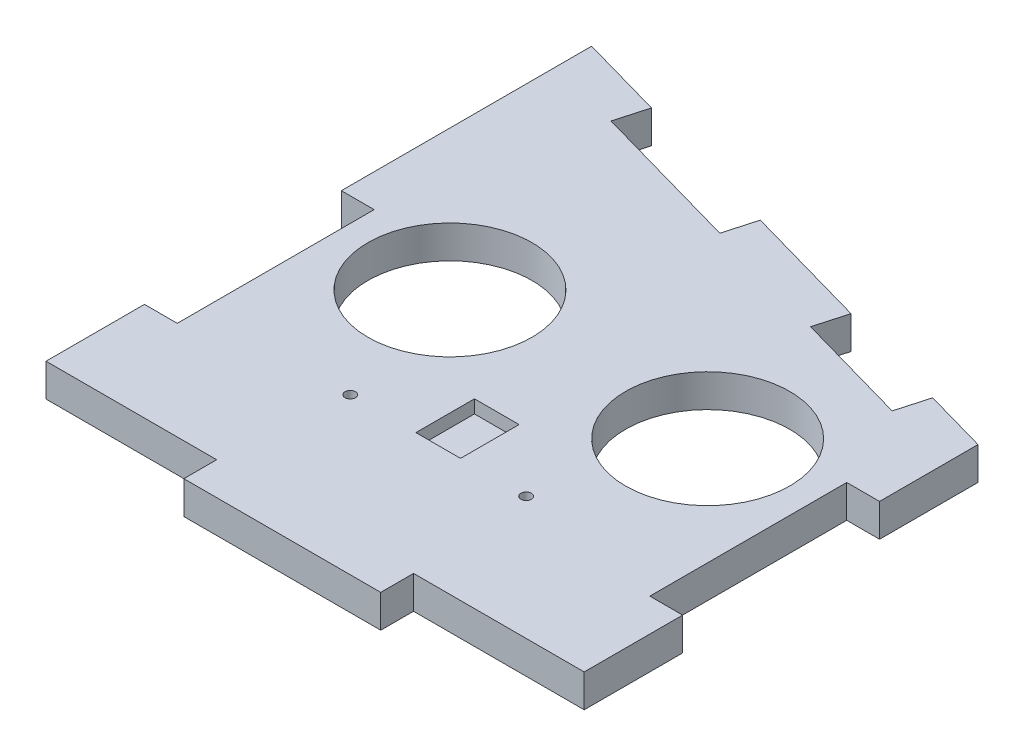
ISO-10303-21;
HEADER;
FILE_DESCRIPTION(('STEP AP214'),'2;1');
FILE_NAME('part.step','',(''),(''),'','','');
FILE_SCHEMA(('AUTOMOTIVE_DESIGN { 1 0 10303 214 1 1 1 1 }'));
ENDSEC;
DATA;
#1=APPLICATION_CONTEXT('core data for automotive mechanical design processes');
#2=APPLICATION_PROTOCOL_DEFINITION('international standard','automotive_design',2000,#1);
#3=PRODUCT_CONTEXT('',#1,'mechanical');
#4=PRODUCT('Part','Part','',(#3));
#5=PRODUCT_RELATED_PRODUCT_CATEGORY('part','',(#4));
#6=PRODUCT_DEFINITION_FORMATION('','',#4);
#7=PRODUCT_DEFINITION_CONTEXT('part definition',#1,'design');
#8=PRODUCT_DEFINITION('design','',#6,#7);
#9=PRODUCT_DEFINITION_SHAPE('','',#8);
#10=(LENGTH_UNIT() NAMED_UNIT(*) SI_UNIT(.MILLI.,.METRE.));
#11=(NAMED_UNIT(*) PLANE_ANGLE_UNIT() SI_UNIT($,.RADIAN.));
#12=(NAMED_UNIT(*) SI_UNIT($,.STERADIAN.) SOLID_ANGLE_UNIT());
#13=UNCERTAINTY_MEASURE_WITH_UNIT(LENGTH_MEASURE(1.E-05),#10,'distance_accuracy_value','');
#14=(GEOMETRIC_REPRESENTATION_CONTEXT(3) GLOBAL_UNCERTAINTY_ASSIGNED_CONTEXT((#13)) GLOBAL_UNIT_ASSIGNED_CONTEXT((#10,
#11,#12)) REPRESENTATION_CONTEXT('',''));
#15=CARTESIAN_POINT('',(0.,0.,0.));
#16=DIRECTION('',(0.,0.,1.));
#17=DIRECTION('',(1.,0.,0.));
#18=AXIS2_PLACEMENT_3D('',#15,#16,#17);
#19=CARTESIAN_POINT('',(0.,3.175,0.));
#20=DIRECTION('',(0.,1.,0.));
#21=DIRECTION('',(0.,0.,1.));
#22=AXIS2_PLACEMENT_3D('',#19,#20,#21);
#23=PLANE('',#22);
#24=CARTESIAN_POINT('',(34.544,3.175,-11.9107261914071));
#25=DIRECTION('',(0.,1.,0.));
#26=DIRECTION('',(0.,0.,1.));
#27=AXIS2_PLACEMENT_3D('',#24,#25,#26);
#28=CIRCLE('',#27,0.508000000000002);
#29=CARTESIAN_POINT('',(34.544,3.175,-11.4027261914071));
#30=VERTEX_POINT('',#29);
#31=EDGE_CURVE('E468',#30,#30,#28,.T.);
#32=ORIENTED_EDGE('',*,*,#31,.F.);
#33=EDGE_LOOP('',(#32));
#34=FACE_BOUND('',#33,.T.);
#35=CARTESIAN_POINT('',(17.526,3.175,-11.9107261914071));
#36=DIRECTION('',(0.,1.,0.));
#37=DIRECTION('',(0.,0.,1.));
#38=AXIS2_PLACEMENT_3D('',#35,#36,#37);
#39=CIRCLE('',#38,0.508000000000002);
#40=CARTESIAN_POINT('',(17.526,3.175,-11.4027261914071));
#41=VERTEX_POINT('',#40);
#42=EDGE_CURVE('E462',#41,#41,#39,.T.);
#43=ORIENTED_EDGE('',*,*,#42,.F.);
#44=EDGE_LOOP('',(#43));
#45=FACE_BOUND('',#44,.T.);
#46=DIRECTION('',(0.,0.,1.));
#47=VECTOR('',#46,1.);
#48=CARTESIAN_POINT('',(23.876,3.175,-17.5749261914071));
#49=LINE('',#48,#47);
#50=CARTESIAN_POINT('',(23.876,3.175,-17.5749261914071));
#51=VERTEX_POINT('',#50);
#52=CARTESIAN_POINT('',(23.876,3.175,-11.9107261914071));
#53=VERTEX_POINT('',#52);
#54=EDGE_CURVE('E48',#51,#53,#49,.T.);
#55=ORIENTED_EDGE('',*,*,#54,.F.);
#56=DIRECTION('',(-1.,0.,0.));
#57=VECTOR('',#56,1.);
#58=CARTESIAN_POINT('',(23.876,3.175,-17.5749261914071));
#59=LINE('',#58,#57);
#60=CARTESIAN_POINT('',(28.194,3.175,-17.5749261914071));
#61=VERTEX_POINT('',#60);
#62=EDGE_CURVE('E440',#61,#51,#59,.T.);
#63=ORIENTED_EDGE('',*,*,#62,.F.);
#64=DIRECTION('',(0.,0.,-1.));
#65=VECTOR('',#64,1.);
#66=CARTESIAN_POINT('',(28.194,3.175,-17.5749261914071));
#67=LINE('',#66,#65);
#68=CARTESIAN_POINT('',(28.194,3.175,-11.9107261914071));
#69=VERTEX_POINT('',#68);
#70=EDGE_CURVE('E444',#69,#61,#67,.T.);
#71=ORIENTED_EDGE('',*,*,#70,.F.);
#72=DIRECTION('',(1.,0.,0.));
#73=VECTOR('',#72,1.);
#74=CARTESIAN_POINT('',(23.876,3.175,-11.9107261914071));
#75=LINE('',#74,#73);
#76=EDGE_CURVE('E447',#53,#69,#75,.T.);
#77=ORIENTED_EDGE('',*,*,#76,.F.);
#78=EDGE_LOOP('',(#55,#63,#71,#77));
#79=FACE_BOUND('',#78,.T.);
#80=CARTESIAN_POINT('',(13.56995,3.175,-25.5124261914071));
#81=DIRECTION('',(0.,1.,0.));
#82=DIRECTION('',(0.,0.,1.));
#83=AXIS2_PLACEMENT_3D('',#80,#81,#82);
#84=CIRCLE('',#83,7.9375);
#85=CARTESIAN_POINT('',(13.56995,3.175,-17.5749261914071));
#86=VERTEX_POINT('',#85);
#87=EDGE_CURVE('E242',#86,#86,#84,.T.);
#88=ORIENTED_EDGE('',*,*,#87,.F.);
#89=EDGE_LOOP('',(#88));
#90=FACE_BOUND('',#89,.T.);
#91=DIRECTION('',(0.,0.,1.));
#92=VECTOR('',#91,1.);
#93=CARTESIAN_POINT('',(0.,3.175,-9.525));
#94=LINE('',#93,#92);
#95=CARTESIAN_POINT('',(0.,3.175,-9.525));
#96=VERTEX_POINT('',#95);
#97=CARTESIAN_POINT('',(0.,3.175,0.));
#98=VERTEX_POINT('',#97);
#99=EDGE_CURVE('E286',#96,#98,#94,.T.);
#100=ORIENTED_EDGE('',*,*,#99,.T.);
#101=DIRECTION('',(1.,0.,0.));
#102=VECTOR('',#101,1.);
#103=CARTESIAN_POINT('',(0.,3.175,0.));
#104=LINE('',#103,#102);
#105=CARTESIAN_POINT('',(16.51,3.175,0.));
#106=VERTEX_POINT('',#105);
#107=EDGE_CURVE('E146',#98,#106,#104,.T.);
#108=ORIENTED_EDGE('',*,*,#107,.T.);
#109=DIRECTION('',(0.,0.,1.));
#110=VECTOR('',#109,1.);
#111=CARTESIAN_POINT('',(16.51,3.175,0.));
#112=LINE('',#111,#110);
#113=CARTESIAN_POINT('',(16.51,3.175,3.175));
#114=VERTEX_POINT('',#113);
#115=EDGE_CURVE('E349',#106,#114,#112,.T.);
#116=ORIENTED_EDGE('',*,*,#115,.T.);
#117=DIRECTION('',(1.,0.,0.));
#118=VECTOR('',#117,1.);
#119=CARTESIAN_POINT('',(16.51,3.175,3.175));
#120=LINE('',#119,#118);
#121=CARTESIAN_POINT('',(35.56,3.175,3.175));
#122=VERTEX_POINT('',#121);
#123=EDGE_CURVE('E368',#114,#122,#120,.T.);
#124=ORIENTED_EDGE('',*,*,#123,.T.);
#125=DIRECTION('',(0.,0.,-1.));
#126=VECTOR('',#125,1.);
#127=CARTESIAN_POINT('',(35.56,3.175,3.175));
#128=LINE('',#127,#126);
#129=CARTESIAN_POINT('',(35.56,3.175,0.));
#130=VERTEX_POINT('',#129);
#131=EDGE_CURVE('E365',#122,#130,#128,.T.);
#132=ORIENTED_EDGE('',*,*,#131,.T.);
#133=DIRECTION('',(1.,0.,0.));
#134=VECTOR('',#133,1.);
#135=CARTESIAN_POINT('',(35.56,3.175,0.));
#136=LINE('',#135,#134);
#137=CARTESIAN_POINT('',(52.07,3.175,0.));
#138=VERTEX_POINT('',#137);
#139=EDGE_CURVE('E367',#130,#138,#136,.T.);
#140=ORIENTED_EDGE('',*,*,#139,.T.);
#141=DIRECTION('',(0.,0.,-1.));
#142=VECTOR('',#141,1.);
#143=CARTESIAN_POINT('',(52.07,3.175,0.));
#144=LINE('',#143,#142);
#145=CARTESIAN_POINT('',(52.07,3.175,-9.525));
#146=VERTEX_POINT('',#145);
#147=EDGE_CURVE('E370',#138,#146,#144,.T.);
#148=ORIENTED_EDGE('',*,*,#147,.T.);
#149=DIRECTION('',(-1.,0.,0.));
#150=VECTOR('',#149,1.);
#151=CARTESIAN_POINT('',(52.07,3.175,-9.525));
#152=LINE('',#151,#150);
#153=CARTESIAN_POINT('',(48.895,3.175,-9.525));
#154=VERTEX_POINT('',#153);
#155=EDGE_CURVE('E376',#146,#154,#152,.T.);
#156=ORIENTED_EDGE('',*,*,#155,.T.);
#157=DIRECTION('',(0.,0.,-1.));
#158=VECTOR('',#157,1.);
#159=CARTESIAN_POINT('',(48.895,3.175,-9.525));
#160=LINE('',#159,#158);
#161=CARTESIAN_POINT('',(48.895,3.175,-28.575));
#162=VERTEX_POINT('',#161);
#163=EDGE_CURVE('E378',#154,#162,#160,.T.);
#164=ORIENTED_EDGE('',*,*,#163,.T.);
#165=DIRECTION('',(1.,0.,0.));
#166=VECTOR('',#165,1.);
#167=CARTESIAN_POINT('',(48.895,3.175,-28.575));
#168=LINE('',#167,#166);
#169=CARTESIAN_POINT('',(52.07,3.175,-28.575));
#170=VERTEX_POINT('',#169);
#171=EDGE_CURVE('E380',#162,#170,#168,.T.);
#172=ORIENTED_EDGE('',*,*,#171,.T.);
#173=DIRECTION('',(0.,0.,-1.));
#174=VECTOR('',#173,1.);
#175=CARTESIAN_POINT('',(52.07,3.175,-28.575));
#176=LINE('',#175,#174);
#177=CARTESIAN_POINT('',(52.07,3.175,-38.1));
#178=VERTEX_POINT('',#177);
#179=EDGE_CURVE('E382',#170,#178,#176,.T.);
#180=ORIENTED_EDGE('',*,*,#179,.T.);
#181=DIRECTION('',(-0.962441314553991,0.,-0.27148980835307));
#182=VECTOR('',#181,1.);
#183=CARTESIAN_POINT('',(52.07,3.175,-38.1));
#184=LINE('',#183,#182);
#185=CARTESIAN_POINT('',(45.9584976525822,3.175,-39.823960283042));
#186=VERTEX_POINT('',#185);
#187=EDGE_CURVE('E384',#178,#186,#184,.T.);
#188=ORIENTED_EDGE('',*,*,#187,.T.);
#189=DIRECTION('',(-0.27148980835307,0.,0.962441314553991));
#190=VECTOR('',#189,1.);
#191=CARTESIAN_POINT('',(45.9584976525822,3.175,-39.823960283042));
#192=LINE('',#191,#190);
#193=CARTESIAN_POINT('',(45.0965175110611,3.175,-36.768209109333));
#194=VERTEX_POINT('',#193);
#195=EDGE_CURVE('E386',#186,#194,#192,.T.);
#196=ORIENTED_EDGE('',*,*,#195,.T.);
#197=DIRECTION('',(-0.962441314553991,0.,-0.271489808353068));
#198=VECTOR('',#197,1.);
#199=CARTESIAN_POINT('',(45.0965175110611,3.175,-36.768209109333));
#200=LINE('',#199,#198);
#201=CARTESIAN_POINT('',(34.095813285709,3.175,-39.8713376188086));
#202=VERTEX_POINT('',#201);
#203=EDGE_CURVE('E388',#194,#202,#200,.T.);
#204=ORIENTED_EDGE('',*,*,#203,.T.);
#205=DIRECTION('',(0.27148980835307,0.,-0.96244131455399));
#206=VECTOR('',#205,1.);
#207=CARTESIAN_POINT('',(34.095813285709,3.175,-39.8713376188086));
#208=LINE('',#207,#206);
#209=CARTESIAN_POINT('',(34.9577934272301,3.175,-42.9270887925176));
#210=VERTEX_POINT('',#209);
#211=EDGE_CURVE('E390',#202,#210,#208,.T.);
#212=ORIENTED_EDGE('',*,*,#211,.T.);
#213=DIRECTION('',(-0.962441314553991,0.,-0.27148980835307));
#214=VECTOR('',#213,1.);
#215=CARTESIAN_POINT('',(34.9577934272301,3.175,-42.9270887925176));
#216=LINE('',#215,#214);
#217=CARTESIAN_POINT('',(22.7347887323944,3.175,-46.3750093586016));
#218=VERTEX_POINT('',#217);
#219=EDGE_CURVE('E392',#210,#218,#216,.T.);
#220=ORIENTED_EDGE('',*,*,#219,.T.);
#221=DIRECTION('',(-0.271489808353069,0.,0.962441314553991));
#222=VECTOR('',#221,1.);
#223=CARTESIAN_POINT('',(22.7347887323944,3.175,-46.3750093586016));
#224=LINE('',#223,#222);
#225=CARTESIAN_POINT('',(21.8728085908734,3.175,-43.3192581848926));
#226=VERTEX_POINT('',#225);
#227=EDGE_CURVE('E394',#218,#226,#224,.T.);
#228=ORIENTED_EDGE('',*,*,#227,.T.);
#229=DIRECTION('',(-0.96244131455399,0.,-0.27148980835307));
#230=VECTOR('',#229,1.);
#231=CARTESIAN_POINT('',(21.8728085908734,3.175,-43.3192581848926));
#232=LINE('',#231,#230);
#233=CARTESIAN_POINT('',(7.20520295707054,3.175,-47.4567628641934));
#234=VERTEX_POINT('',#233);
#235=EDGE_CURVE('E396',#226,#234,#232,.T.);
#236=ORIENTED_EDGE('',*,*,#235,.T.);
#237=DIRECTION('',(0.27148980835307,0.,-0.962441314553991));
#238=VECTOR('',#237,1.);
#239=CARTESIAN_POINT('',(7.20520295707054,3.175,-47.4567628641934));
#240=LINE('',#239,#238);
#241=CARTESIAN_POINT('',(8.06718309859155,3.175,-50.5125140379023));
#242=VERTEX_POINT('',#241);
#243=EDGE_CURVE('E398',#234,#242,#240,.T.);
#244=ORIENTED_EDGE('',*,*,#243,.T.);
#245=DIRECTION('',(-0.962441314553991,0.,-0.27148980835307));
#246=VECTOR('',#245,1.);
#247=CARTESIAN_POINT('',(8.06718309859155,3.175,-50.5125140379023));
#248=LINE('',#247,#246);
#249=CARTESIAN_POINT('',(0.,3.175,-52.7881416115178));
#250=VERTEX_POINT('',#249);
#251=EDGE_CURVE('E400',#242,#250,#248,.T.);
#252=ORIENTED_EDGE('',*,*,#251,.T.);
#253=DIRECTION('',(0.,0.,1.));
#254=VECTOR('',#253,1.);
#255=CARTESIAN_POINT('',(0.,3.175,-52.7881416115178));
#256=LINE('',#255,#254);
#257=CARTESIAN_POINT('',(0.,3.175,-28.575));
#258=VERTEX_POINT('',#257);
#259=EDGE_CURVE('E217',#250,#258,#256,.T.);
#260=ORIENTED_EDGE('',*,*,#259,.T.);
#261=DIRECTION('',(1.,0.,0.));
#262=VECTOR('',#261,1.);
#263=CARTESIAN_POINT('',(0.,3.175,-28.575));
#264=LINE('',#263,#262);
#265=CARTESIAN_POINT('',(3.175,3.175,-28.575));
#266=VERTEX_POINT('',#265);
#267=EDGE_CURVE('E210',#258,#266,#264,.T.);
#268=ORIENTED_EDGE('',*,*,#267,.T.);
#269=DIRECTION('',(0.,0.,1.));
#270=VECTOR('',#269,1.);
#271=CARTESIAN_POINT('',(3.175,3.175,-28.575));
#272=LINE('',#271,#270);
#273=CARTESIAN_POINT('',(3.175,3.175,-9.525));
#274=VERTEX_POINT('',#273);
#275=EDGE_CURVE('E214',#266,#274,#272,.T.);
#276=ORIENTED_EDGE('',*,*,#275,.T.);
#277=DIRECTION('',(-1.,0.,0.));
#278=VECTOR('',#277,1.);
#279=CARTESIAN_POINT('',(3.175,3.175,-9.525));
#280=LINE('',#279,#278);
#281=EDGE_CURVE('E57',#274,#96,#280,.T.);
#282=ORIENTED_EDGE('',*,*,#281,.T.);
#283=EDGE_LOOP('',(#100,#108,#116,#124,#132,#140,#148,#156,#164,#172,#180,#188,#196,#204,#212,
#220,#228,#236,#244,#252,#260,#268,#276,#282));
#284=FACE_BOUND('',#283,.T.);
#285=CARTESIAN_POINT('',(38.50005,3.175,-25.5124261914071));
#286=DIRECTION('',(0.,1.,0.));
#287=DIRECTION('',(0.,0.,1.));
#288=AXIS2_PLACEMENT_3D('',#285,#286,#287);
#289=CIRCLE('',#288,7.9375);
#290=CARTESIAN_POINT('',(38.50005,3.175,-17.5749261914071));
#291=VERTEX_POINT('',#290);
#292=EDGE_CURVE('E421',#291,#291,#289,.T.);
#293=ORIENTED_EDGE('',*,*,#292,.F.);
#294=EDGE_LOOP('',(#293));
#295=FACE_BOUND('',#294,.T.);
#296=ADVANCED_FACE('F33',(#34,#45,#79,#90,#284,#295),#23,.T.);
#297=CARTESIAN_POINT('',(0.,0.,0.));
#298=DIRECTION('',(0.,1.,0.));
#299=DIRECTION('',(0.,0.,1.));
#300=AXIS2_PLACEMENT_3D('',#297,#298,#299);
#301=PLANE('',#300);
#302=CARTESIAN_POINT('',(34.544,0.,-11.9107261914071));
#303=DIRECTION('',(0.,1.,0.));
#304=DIRECTION('',(0.,0.,1.));
#305=AXIS2_PLACEMENT_3D('',#302,#303,#304);
#306=CIRCLE('',#305,0.508000000000002);
#307=CARTESIAN_POINT('',(34.544,0.,-11.4027261914071));
#308=VERTEX_POINT('',#307);
#309=EDGE_CURVE('E465',#308,#308,#306,.T.);
#310=ORIENTED_EDGE('',*,*,#309,.T.);
#311=EDGE_LOOP('',(#310));
#312=FACE_BOUND('',#311,.T.);
#313=CARTESIAN_POINT('',(17.526,0.,-11.9107261914071));
#314=DIRECTION('',(0.,1.,0.));
#315=DIRECTION('',(0.,0.,1.));
#316=AXIS2_PLACEMENT_3D('',#313,#314,#315);
#317=CIRCLE('',#316,0.508000000000002);
#318=CARTESIAN_POINT('',(17.526,0.,-11.4027261914071));
#319=VERTEX_POINT('',#318);
#320=EDGE_CURVE('E451',#319,#319,#317,.T.);
#321=ORIENTED_EDGE('',*,*,#320,.T.);
#322=EDGE_LOOP('',(#321));
#323=FACE_BOUND('',#322,.T.);
#324=DIRECTION('',(0.,0.,1.));
#325=VECTOR('',#324,1.);
#326=CARTESIAN_POINT('',(0.,0.,-9.525));
#327=LINE('',#326,#325);
#328=CARTESIAN_POINT('',(0.,0.,-9.525));
#329=VERTEX_POINT('',#328);
#330=CARTESIAN_POINT('',(0.,0.,0.));
#331=VERTEX_POINT('',#330);
#332=EDGE_CURVE('E238',#329,#331,#327,.T.);
#333=ORIENTED_EDGE('',*,*,#332,.F.);
#334=DIRECTION('',(-1.,0.,0.));
#335=VECTOR('',#334,1.);
#336=CARTESIAN_POINT('',(3.175,0.,-9.525));
#337=LINE('',#336,#335);
#338=CARTESIAN_POINT('',(3.175,0.,-9.525));
#339=VERTEX_POINT('',#338);
#340=EDGE_CURVE('E138',#339,#329,#337,.T.);
#341=ORIENTED_EDGE('',*,*,#340,.F.);
#342=DIRECTION('',(0.,0.,1.));
#343=VECTOR('',#342,1.);
#344=CARTESIAN_POINT('',(3.175,0.,-28.575));
#345=LINE('',#344,#343);
#346=CARTESIAN_POINT('',(3.175,0.,-28.575));
#347=VERTEX_POINT('',#346);
#348=EDGE_CURVE('E283',#347,#339,#345,.T.);
#349=ORIENTED_EDGE('',*,*,#348,.F.);
#350=DIRECTION('',(1.,0.,0.));
#351=VECTOR('',#350,1.);
#352=CARTESIAN_POINT('',(0.,0.,-28.575));
#353=LINE('',#352,#351);
#354=CARTESIAN_POINT('',(0.,0.,-28.575));
#355=VERTEX_POINT('',#354);
#356=EDGE_CURVE('E226',#355,#347,#353,.T.);
#357=ORIENTED_EDGE('',*,*,#356,.F.);
#358=DIRECTION('',(0.,0.,1.));
#359=VECTOR('',#358,1.);
#360=CARTESIAN_POINT('',(0.,0.,-52.7881416115178));
#361=LINE('',#360,#359);
#362=CARTESIAN_POINT('',(0.,0.,-52.7881416115178));
#363=VERTEX_POINT('',#362);
#364=EDGE_CURVE('E280',#363,#355,#361,.T.);
#365=ORIENTED_EDGE('',*,*,#364,.F.);
#366=DIRECTION('',(-0.962441314553991,0.,-0.27148980835307));
#367=VECTOR('',#366,1.);
#368=CARTESIAN_POINT('',(8.06718309859155,0.,-50.5125140379023));
#369=LINE('',#368,#367);
#370=CARTESIAN_POINT('',(8.06718309859155,0.,-50.5125140379023));
#371=VERTEX_POINT('',#370);
#372=EDGE_CURVE('E278',#371,#363,#369,.T.);
#373=ORIENTED_EDGE('',*,*,#372,.F.);
#374=DIRECTION('',(0.27148980835307,0.,-0.962441314553991));
#375=VECTOR('',#374,1.);
#376=CARTESIAN_POINT('',(7.20520295707054,0.,-47.4567628641934));
#377=LINE('',#376,#375);
#378=CARTESIAN_POINT('',(7.20520295707054,0.,-47.4567628641934));
#379=VERTEX_POINT('',#378);
#380=EDGE_CURVE('E276',#379,#371,#377,.T.);
#381=ORIENTED_EDGE('',*,*,#380,.F.);
#382=DIRECTION('',(-0.96244131455399,0.,-0.27148980835307));
#383=VECTOR('',#382,1.);
#384=CARTESIAN_POINT('',(21.8728085908734,0.,-43.3192581848926));
#385=LINE('',#384,#383);
#386=CARTESIAN_POINT('',(21.8728085908734,0.,-43.3192581848926));
#387=VERTEX_POINT('',#386);
#388=EDGE_CURVE('E274',#387,#379,#385,.T.);
#389=ORIENTED_EDGE('',*,*,#388,.F.);
#390=DIRECTION('',(-0.271489808353069,0.,0.962441314553991));
#391=VECTOR('',#390,1.);
#392=CARTESIAN_POINT('',(22.7347887323944,0.,-46.3750093586016));
#393=LINE('',#392,#391);
#394=CARTESIAN_POINT('',(22.7347887323944,0.,-46.3750093586016));
#395=VERTEX_POINT('',#394);
#396=EDGE_CURVE('E272',#395,#387,#393,.T.);
#397=ORIENTED_EDGE('',*,*,#396,.F.);
#398=DIRECTION('',(-0.962441314553991,0.,-0.27148980835307));
#399=VECTOR('',#398,1.);
#400=CARTESIAN_POINT('',(34.9577934272301,0.,-42.9270887925176));
#401=LINE('',#400,#399);
#402=CARTESIAN_POINT('',(34.9577934272301,0.,-42.9270887925176));
#403=VERTEX_POINT('',#402);
#404=EDGE_CURVE('E270',#403,#395,#401,.T.);
#405=ORIENTED_EDGE('',*,*,#404,.F.);
#406=DIRECTION('',(0.27148980835307,0.,-0.96244131455399));
#407=VECTOR('',#406,1.);
#408=CARTESIAN_POINT('',(34.095813285709,0.,-39.8713376188086));
#409=LINE('',#408,#407);
#410=CARTESIAN_POINT('',(34.095813285709,0.,-39.8713376188086));
#411=VERTEX_POINT('',#410);
#412=EDGE_CURVE('E268',#411,#403,#409,.T.);
#413=ORIENTED_EDGE('',*,*,#412,.F.);
#414=DIRECTION('',(-0.962441314553991,0.,-0.271489808353068));
#415=VECTOR('',#414,1.);
#416=CARTESIAN_POINT('',(45.0965175110611,0.,-36.768209109333));
#417=LINE('',#416,#415);
#418=CARTESIAN_POINT('',(45.0965175110611,0.,-36.768209109333));
#419=VERTEX_POINT('',#418);
#420=EDGE_CURVE('E266',#419,#411,#417,.T.);
#421=ORIENTED_EDGE('',*,*,#420,.F.);
#422=DIRECTION('',(-0.27148980835307,0.,0.962441314553991));
#423=VECTOR('',#422,1.);
#424=CARTESIAN_POINT('',(45.9584976525822,0.,-39.823960283042));
#425=LINE('',#424,#423);
#426=CARTESIAN_POINT('',(45.9584976525822,0.,-39.823960283042));
#427=VERTEX_POINT('',#426);
#428=EDGE_CURVE('E264',#427,#419,#425,.T.);
#429=ORIENTED_EDGE('',*,*,#428,.F.);
#430=DIRECTION('',(-0.962441314553991,0.,-0.27148980835307));
#431=VECTOR('',#430,1.);
#432=CARTESIAN_POINT('',(52.07,0.,-38.1));
#433=LINE('',#432,#431);
#434=CARTESIAN_POINT('',(52.07,0.,-38.1));
#435=VERTEX_POINT('',#434);
#436=EDGE_CURVE('E262',#435,#427,#433,.T.);
#437=ORIENTED_EDGE('',*,*,#436,.F.);
#438=DIRECTION('',(0.,0.,-1.));
#439=VECTOR('',#438,1.);
#440=CARTESIAN_POINT('',(52.07,0.,-28.575));
#441=LINE('',#440,#439);
#442=CARTESIAN_POINT('',(52.07,0.,-28.575));
#443=VERTEX_POINT('',#442);
#444=EDGE_CURVE('E260',#443,#435,#441,.T.);
#445=ORIENTED_EDGE('',*,*,#444,.F.);
#446=DIRECTION('',(1.,0.,0.));
#447=VECTOR('',#446,1.);
#448=CARTESIAN_POINT('',(48.895,0.,-28.575));
#449=LINE('',#448,#447);
#450=CARTESIAN_POINT('',(48.895,0.,-28.575));
#451=VERTEX_POINT('',#450);
#452=EDGE_CURVE('E258',#451,#443,#449,.T.);
#453=ORIENTED_EDGE('',*,*,#452,.F.);
#454=DIRECTION('',(0.,0.,-1.));
#455=VECTOR('',#454,1.);
#456=CARTESIAN_POINT('',(48.895,0.,-9.525));
#457=LINE('',#456,#455);
#458=CARTESIAN_POINT('',(48.895,0.,-9.525));
#459=VERTEX_POINT('',#458);
#460=EDGE_CURVE('E256',#459,#451,#457,.T.);
#461=ORIENTED_EDGE('',*,*,#460,.F.);
#462=DIRECTION('',(-1.,0.,0.));
#463=VECTOR('',#462,1.);
#464=CARTESIAN_POINT('',(52.07,0.,-9.525));
#465=LINE('',#464,#463);
#466=CARTESIAN_POINT('',(52.07,0.,-9.525));
#467=VERTEX_POINT('',#466);
#468=EDGE_CURVE('E254',#467,#459,#465,.T.);
#469=ORIENTED_EDGE('',*,*,#468,.F.);
#470=DIRECTION('',(0.,0.,-1.));
#471=VECTOR('',#470,1.);
#472=CARTESIAN_POINT('',(52.07,0.,0.));
#473=LINE('',#472,#471);
#474=CARTESIAN_POINT('',(52.07,0.,0.));
#475=VERTEX_POINT('',#474);
#476=EDGE_CURVE('E252',#475,#467,#473,.T.);
#477=ORIENTED_EDGE('',*,*,#476,.F.);
#478=DIRECTION('',(1.,0.,0.));
#479=VECTOR('',#478,1.);
#480=CARTESIAN_POINT('',(35.56,0.,0.));
#481=LINE('',#480,#479);
#482=CARTESIAN_POINT('',(35.56,0.,0.));
#483=VERTEX_POINT('',#482);
#484=EDGE_CURVE('E250',#483,#475,#481,.T.);
#485=ORIENTED_EDGE('',*,*,#484,.F.);
#486=DIRECTION('',(0.,0.,-1.));
#487=VECTOR('',#486,1.);
#488=CARTESIAN_POINT('',(35.56,0.,3.175));
#489=LINE('',#488,#487);
#490=CARTESIAN_POINT('',(35.56,0.,3.175));
#491=VERTEX_POINT('',#490);
#492=EDGE_CURVE('E248',#491,#483,#489,.T.);
#493=ORIENTED_EDGE('',*,*,#492,.F.);
#494=DIRECTION('',(1.,0.,0.));
#495=VECTOR('',#494,1.);
#496=CARTESIAN_POINT('',(16.51,0.,3.175));
#497=LINE('',#496,#495);
#498=CARTESIAN_POINT('',(16.51,0.,3.175));
#499=VERTEX_POINT('',#498);
#500=EDGE_CURVE('E246',#499,#491,#497,.T.);
#501=ORIENTED_EDGE('',*,*,#500,.F.);
#502=DIRECTION('',(0.,0.,1.));
#503=VECTOR('',#502,1.);
#504=CARTESIAN_POINT('',(16.51,0.,0.));
#505=LINE('',#504,#503);
#506=CARTESIAN_POINT('',(16.51,0.,0.));
#507=VERTEX_POINT('',#506);
#508=EDGE_CURVE('E244',#507,#499,#505,.T.);
#509=ORIENTED_EDGE('',*,*,#508,.F.);
#510=DIRECTION('',(1.,0.,0.));
#511=VECTOR('',#510,1.);
#512=CARTESIAN_POINT('',(0.,0.,0.));
#513=LINE('',#512,#511);
#514=EDGE_CURVE('E241',#331,#507,#513,.T.);
#515=ORIENTED_EDGE('',*,*,#514,.F.);
#516=EDGE_LOOP('',(#333,#341,#349,#357,#365,#373,#381,#389,#397,#405,#413,#421,#429,#437,#445,
#453,#461,#469,#477,#485,#493,#501,#509,#515));
#517=FACE_BOUND('',#516,.T.);
#518=CARTESIAN_POINT('',(13.56995,0.,-25.5124261914071));
#519=DIRECTION('',(0.,1.,0.));
#520=DIRECTION('',(0.,0.,1.));
#521=AXIS2_PLACEMENT_3D('',#518,#519,#520);
#522=CIRCLE('',#521,7.9375);
#523=CARTESIAN_POINT('',(13.56995,0.,-17.5749261914071));
#524=VERTEX_POINT('',#523);
#525=EDGE_CURVE('E418',#524,#524,#522,.T.);
#526=ORIENTED_EDGE('',*,*,#525,.T.);
#527=EDGE_LOOP('',(#526));
#528=FACE_BOUND('',#527,.T.);
#529=CARTESIAN_POINT('',(38.50005,0.,-25.5124261914071));
#530=DIRECTION('',(0.,1.,0.));
#531=DIRECTION('',(0.,0.,1.));
#532=AXIS2_PLACEMENT_3D('',#529,#530,#531);
#533=CIRCLE('',#532,7.9375);
#534=CARTESIAN_POINT('',(38.50005,0.,-17.5749261914071));
#535=VERTEX_POINT('',#534);
#536=EDGE_CURVE('E424',#535,#535,#533,.T.);
#537=ORIENTED_EDGE('',*,*,#536,.T.);
#538=EDGE_LOOP('',(#537));
#539=FACE_BOUND('',#538,.T.);
#540=ADVANCED_FACE('F353',(#312,#323,#517,#528,#539),#301,.F.);
#541=CARTESIAN_POINT('',(0.,3.175,-9.525));
#542=DIRECTION('',(1.,0.,0.));
#543=DIRECTION('',(0.,0.,-1.));
#544=AXIS2_PLACEMENT_3D('',#541,#542,#543);
#545=PLANE('',#544);
#546=ORIENTED_EDGE('',*,*,#332,.T.);
#547=DIRECTION('',(0.,-1.,0.));
#548=VECTOR('',#547,1.);
#549=CARTESIAN_POINT('',(0.,3.175,0.));
#550=LINE('',#549,#548);
#551=EDGE_CURVE('E11',#98,#331,#550,.T.);
#552=ORIENTED_EDGE('',*,*,#551,.F.);
#553=ORIENTED_EDGE('',*,*,#99,.F.);
#554=DIRECTION('',(0.,-1.,0.));
#555=VECTOR('',#554,1.);
#556=CARTESIAN_POINT('',(0.,3.175,-9.525));
#557=LINE('',#556,#555);
#558=EDGE_CURVE('E234',#96,#329,#557,.T.);
#559=ORIENTED_EDGE('',*,*,#558,.T.);
#560=EDGE_LOOP('',(#546,#552,#553,#559));
#561=FACE_BOUND('',#560,.T.);
#562=ADVANCED_FACE('F35',(#561),#545,.F.);
#563=CARTESIAN_POINT('',(0.,3.175,0.));
#564=DIRECTION('',(0.,0.,-1.));
#565=DIRECTION('',(-1.,0.,0.));
#566=AXIS2_PLACEMENT_3D('',#563,#564,#565);
#567=PLANE('',#566);
#568=ORIENTED_EDGE('',*,*,#514,.T.);
#569=DIRECTION('',(0.,-1.,0.));
#570=VECTOR('',#569,1.);
#571=CARTESIAN_POINT('',(16.51,3.175,0.));
#572=LINE('',#571,#570);
#573=EDGE_CURVE('E41',#106,#507,#572,.T.);
#574=ORIENTED_EDGE('',*,*,#573,.F.);
#575=ORIENTED_EDGE('',*,*,#107,.F.);
#576=ORIENTED_EDGE('',*,*,#551,.T.);
#577=EDGE_LOOP('',(#568,#574,#575,#576));
#578=FACE_BOUND('',#577,.T.);
#579=ADVANCED_FACE('F586',(#578),#567,.F.);
#580=CARTESIAN_POINT('',(16.51,3.175,0.));
#581=DIRECTION('',(1.,0.,0.));
#582=DIRECTION('',(0.,0.,-1.));
#583=AXIS2_PLACEMENT_3D('',#580,#581,#582);
#584=PLANE('',#583);
#585=ORIENTED_EDGE('',*,*,#508,.T.);
#586=DIRECTION('',(0.,-1.,0.));
#587=VECTOR('',#586,1.);
#588=CARTESIAN_POINT('',(16.51,3.175,3.175));
#589=LINE('',#588,#587);
#590=EDGE_CURVE('E341',#114,#499,#589,.T.);
#591=ORIENTED_EDGE('',*,*,#590,.F.);
#592=ORIENTED_EDGE('',*,*,#115,.F.);
#593=ORIENTED_EDGE('',*,*,#573,.T.);
#594=EDGE_LOOP('',(#585,#591,#592,#593));
#595=FACE_BOUND('',#594,.T.);
#596=ADVANCED_FACE('F347',(#595),#584,.F.);
#597=CARTESIAN_POINT('',(16.51,3.175,3.175));
#598=DIRECTION('',(0.,0.,-1.));
#599=DIRECTION('',(-1.,0.,0.));
#600=AXIS2_PLACEMENT_3D('',#597,#598,#599);
#601=PLANE('',#600);
#602=ORIENTED_EDGE('',*,*,#500,.T.);
#603=DIRECTION('',(0.,-1.,0.));
#604=VECTOR('',#603,1.);
#605=CARTESIAN_POINT('',(35.56,3.175,3.175));
#606=LINE('',#605,#604);
#607=EDGE_CURVE('E338',#122,#491,#606,.T.);
#608=ORIENTED_EDGE('',*,*,#607,.F.);
#609=ORIENTED_EDGE('',*,*,#123,.F.);
#610=ORIENTED_EDGE('',*,*,#590,.T.);
#611=EDGE_LOOP('',(#602,#608,#609,#610));
#612=FACE_BOUND('',#611,.T.);
#613=ADVANCED_FACE('F359',(#612),#601,.F.);
#614=CARTESIAN_POINT('',(35.56,3.175,3.175));
#615=DIRECTION('',(-1.,0.,0.));
#616=DIRECTION('',(0.,0.,1.));
#617=AXIS2_PLACEMENT_3D('',#614,#615,#616);
#618=PLANE('',#617);
#619=ORIENTED_EDGE('',*,*,#492,.T.);
#620=DIRECTION('',(0.,-1.,0.));
#621=VECTOR('',#620,1.);
#622=CARTESIAN_POINT('',(35.56,3.175,0.));
#623=LINE('',#622,#621);
#624=EDGE_CURVE('E335',#130,#483,#623,.T.);
#625=ORIENTED_EDGE('',*,*,#624,.F.);
#626=ORIENTED_EDGE('',*,*,#131,.F.);
#627=ORIENTED_EDGE('',*,*,#607,.T.);
#628=EDGE_LOOP('',(#619,#625,#626,#627));
#629=FACE_BOUND('',#628,.T.);
#630=ADVANCED_FACE('F363',(#629),#618,.F.);
#631=CARTESIAN_POINT('',(35.56,3.175,0.));
#632=DIRECTION('',(0.,0.,-1.));
#633=DIRECTION('',(-1.,0.,0.));
#634=AXIS2_PLACEMENT_3D('',#631,#632,#633);
#635=PLANE('',#634);
#636=ORIENTED_EDGE('',*,*,#484,.T.);
#637=DIRECTION('',(0.,-1.,0.));
#638=VECTOR('',#637,1.);
#639=CARTESIAN_POINT('',(52.07,3.175,0.));
#640=LINE('',#639,#638);
#641=EDGE_CURVE('E332',#138,#475,#640,.T.);
#642=ORIENTED_EDGE('',*,*,#641,.F.);
#643=ORIENTED_EDGE('',*,*,#139,.F.);
#644=ORIENTED_EDGE('',*,*,#624,.T.);
#645=EDGE_LOOP('',(#636,#642,#643,#644));
#646=FACE_BOUND('',#645,.T.);
#647=ADVANCED_FACE('F576',(#646),#635,.F.);
#648=CARTESIAN_POINT('',(52.07,3.175,0.));
#649=DIRECTION('',(-1.,0.,0.));
#650=DIRECTION('',(0.,0.,1.));
#651=AXIS2_PLACEMENT_3D('',#648,#649,#650);
#652=PLANE('',#651);
#653=ORIENTED_EDGE('',*,*,#476,.T.);
#654=DIRECTION('',(0.,-1.,0.));
#655=VECTOR('',#654,1.);
#656=CARTESIAN_POINT('',(52.07,3.175,-9.525));
#657=LINE('',#656,#655);
#658=EDGE_CURVE('E329',#146,#467,#657,.T.);
#659=ORIENTED_EDGE('',*,*,#658,.F.);
#660=ORIENTED_EDGE('',*,*,#147,.F.);
#661=ORIENTED_EDGE('',*,*,#641,.T.);
#662=EDGE_LOOP('',(#653,#659,#660,#661));
#663=FACE_BOUND('',#662,.T.);
#664=ADVANCED_FACE('F572',(#663),#652,.F.);
#665=CARTESIAN_POINT('',(52.07,3.175,-9.525));
#666=DIRECTION('',(0.,0.,1.));
#667=DIRECTION('',(1.,0.,0.));
#668=AXIS2_PLACEMENT_3D('',#665,#666,#667);
#669=PLANE('',#668);
#670=ORIENTED_EDGE('',*,*,#468,.T.);
#671=DIRECTION('',(0.,-1.,0.));
#672=VECTOR('',#671,1.);
#673=CARTESIAN_POINT('',(48.895,3.175,-9.525));
#674=LINE('',#673,#672);
#675=EDGE_CURVE('E326',#154,#459,#674,.T.);
#676=ORIENTED_EDGE('',*,*,#675,.F.);
#677=ORIENTED_EDGE('',*,*,#155,.F.);
#678=ORIENTED_EDGE('',*,*,#658,.T.);
#679=EDGE_LOOP('',(#670,#676,#677,#678));
#680=FACE_BOUND('',#679,.T.);
#681=ADVANCED_FACE('F568',(#680),#669,.F.);
#682=CARTESIAN_POINT('',(48.895,3.175,-9.525));
#683=DIRECTION('',(-1.,0.,0.));
#684=DIRECTION('',(0.,0.,1.));
#685=AXIS2_PLACEMENT_3D('',#682,#683,#684);
#686=PLANE('',#685);
#687=ORIENTED_EDGE('',*,*,#460,.T.);
#688=DIRECTION('',(0.,-1.,0.));
#689=VECTOR('',#688,1.);
#690=CARTESIAN_POINT('',(48.895,3.175,-28.575));
#691=LINE('',#690,#689);
#692=EDGE_CURVE('E323',#162,#451,#691,.T.);
#693=ORIENTED_EDGE('',*,*,#692,.F.);
#694=ORIENTED_EDGE('',*,*,#163,.F.);
#695=ORIENTED_EDGE('',*,*,#675,.T.);
#696=EDGE_LOOP('',(#687,#693,#694,#695));
#697=FACE_BOUND('',#696,.T.);
#698=ADVANCED_FACE('F564',(#697),#686,.F.);
#699=CARTESIAN_POINT('',(48.895,3.175,-28.575));
#700=DIRECTION('',(0.,0.,-1.));
#701=DIRECTION('',(-1.,0.,0.));
#702=AXIS2_PLACEMENT_3D('',#699,#700,#701);
#703=PLANE('',#702);
#704=ORIENTED_EDGE('',*,*,#452,.T.);
#705=DIRECTION('',(0.,-1.,0.));
#706=VECTOR('',#705,1.);
#707=CARTESIAN_POINT('',(52.07,3.175,-28.575));
#708=LINE('',#707,#706);
#709=EDGE_CURVE('E320',#170,#443,#708,.T.);
#710=ORIENTED_EDGE('',*,*,#709,.F.);
#711=ORIENTED_EDGE('',*,*,#171,.F.);
#712=ORIENTED_EDGE('',*,*,#692,.T.);
#713=EDGE_LOOP('',(#704,#710,#711,#712));
#714=FACE_BOUND('',#713,.T.);
#715=ADVANCED_FACE('F560',(#714),#703,.F.);
#716=CARTESIAN_POINT('',(52.07,3.175,-28.575));
#717=DIRECTION('',(-1.,0.,0.));
#718=DIRECTION('',(0.,0.,1.));
#719=AXIS2_PLACEMENT_3D('',#716,#717,#718);
#720=PLANE('',#719);
#721=ORIENTED_EDGE('',*,*,#444,.T.);
#722=DIRECTION('',(0.,-1.,0.));
#723=VECTOR('',#722,1.);
#724=CARTESIAN_POINT('',(52.07,3.175,-38.1));
#725=LINE('',#724,#723);
#726=EDGE_CURVE('E317',#178,#435,#725,.T.);
#727=ORIENTED_EDGE('',*,*,#726,.F.);
#728=ORIENTED_EDGE('',*,*,#179,.F.);
#729=ORIENTED_EDGE('',*,*,#709,.T.);
#730=EDGE_LOOP('',(#721,#727,#728,#729));
#731=FACE_BOUND('',#730,.T.);
#732=ADVANCED_FACE('F556',(#731),#720,.F.);
#733=CARTESIAN_POINT('',(52.07,3.175,-38.1));
#734=DIRECTION('',(-0.27148980835307,0.,0.962441314553991));
#735=DIRECTION('',(0.962441314553991,0.,0.27148980835307));
#736=AXIS2_PLACEMENT_3D('',#733,#734,#735);
#737=PLANE('',#736);
#738=ORIENTED_EDGE('',*,*,#436,.T.);
#739=DIRECTION('',(0.,-1.,0.));
#740=VECTOR('',#739,1.);
#741=CARTESIAN_POINT('',(45.9584976525822,3.175,-39.823960283042));
#742=LINE('',#741,#740);
#743=EDGE_CURVE('E314',#186,#427,#742,.T.);
#744=ORIENTED_EDGE('',*,*,#743,.F.);
#745=ORIENTED_EDGE('',*,*,#187,.F.);
#746=ORIENTED_EDGE('',*,*,#726,.T.);
#747=EDGE_LOOP('',(#738,#744,#745,#746));
#748=FACE_BOUND('',#747,.T.);
#749=ADVANCED_FACE('F552',(#748),#737,.F.);
#750=CARTESIAN_POINT('',(45.9584976525822,3.175,-39.823960283042));
#751=DIRECTION('',(0.962441314553991,0.,0.27148980835307));
#752=DIRECTION('',(0.27148980835307,0.,-0.962441314553991));
#753=AXIS2_PLACEMENT_3D('',#750,#751,#752);
#754=PLANE('',#753);
#755=ORIENTED_EDGE('',*,*,#428,.T.);
#756=DIRECTION('',(0.,-1.,0.));
#757=VECTOR('',#756,1.);
#758=CARTESIAN_POINT('',(45.0965175110611,3.175,-36.768209109333));
#759=LINE('',#758,#757);
#760=EDGE_CURVE('E311',#194,#419,#759,.T.);
#761=ORIENTED_EDGE('',*,*,#760,.F.);
#762=ORIENTED_EDGE('',*,*,#195,.F.);
#763=ORIENTED_EDGE('',*,*,#743,.T.);
#764=EDGE_LOOP('',(#755,#761,#762,#763));
#765=FACE_BOUND('',#764,.T.);
#766=ADVANCED_FACE('F548',(#765),#754,.F.);
#767=CARTESIAN_POINT('',(45.0965175110611,3.175,-36.768209109333));
#768=DIRECTION('',(-0.271489808353068,0.,0.962441314553991));
#769=DIRECTION('',(0.962441314553991,0.,0.271489808353068));
#770=AXIS2_PLACEMENT_3D('',#767,#768,#769);
#771=PLANE('',#770);
#772=ORIENTED_EDGE('',*,*,#420,.T.);
#773=DIRECTION('',(0.,-1.,0.));
#774=VECTOR('',#773,1.);
#775=CARTESIAN_POINT('',(34.095813285709,3.175,-39.8713376188086));
#776=LINE('',#775,#774);
#777=EDGE_CURVE('E308',#202,#411,#776,.T.);
#778=ORIENTED_EDGE('',*,*,#777,.F.);
#779=ORIENTED_EDGE('',*,*,#203,.F.);
#780=ORIENTED_EDGE('',*,*,#760,.T.);
#781=EDGE_LOOP('',(#772,#778,#779,#780));
#782=FACE_BOUND('',#781,.T.);
#783=ADVANCED_FACE('F544',(#782),#771,.F.);
#784=CARTESIAN_POINT('',(34.095813285709,3.175,-39.8713376188086));
#785=DIRECTION('',(-0.96244131455399,0.,-0.27148980835307));
#786=DIRECTION('',(-0.27148980835307,0.,0.96244131455399));
#787=AXIS2_PLACEMENT_3D('',#784,#785,#786);
#788=PLANE('',#787);
#789=ORIENTED_EDGE('',*,*,#412,.T.);
#790=DIRECTION('',(0.,-1.,0.));
#791=VECTOR('',#790,1.);
#792=CARTESIAN_POINT('',(34.9577934272301,3.175,-42.9270887925176));
#793=LINE('',#792,#791);
#794=EDGE_CURVE('E305',#210,#403,#793,.T.);
#795=ORIENTED_EDGE('',*,*,#794,.F.);
#796=ORIENTED_EDGE('',*,*,#211,.F.);
#797=ORIENTED_EDGE('',*,*,#777,.T.);
#798=EDGE_LOOP('',(#789,#795,#796,#797));
#799=FACE_BOUND('',#798,.T.);
#800=ADVANCED_FACE('F540',(#799),#788,.F.);
#801=CARTESIAN_POINT('',(34.9577934272301,3.175,-42.9270887925176));
#802=DIRECTION('',(-0.27148980835307,0.,0.962441314553991));
#803=DIRECTION('',(0.962441314553991,0.,0.27148980835307));
#804=AXIS2_PLACEMENT_3D('',#801,#802,#803);
#805=PLANE('',#804);
#806=ORIENTED_EDGE('',*,*,#404,.T.);
#807=DIRECTION('',(0.,-1.,0.));
#808=VECTOR('',#807,1.);
#809=CARTESIAN_POINT('',(22.7347887323944,3.175,-46.3750093586016));
#810=LINE('',#809,#808);
#811=EDGE_CURVE('E302',#218,#395,#810,.T.);
#812=ORIENTED_EDGE('',*,*,#811,.F.);
#813=ORIENTED_EDGE('',*,*,#219,.F.);
#814=ORIENTED_EDGE('',*,*,#794,.T.);
#815=EDGE_LOOP('',(#806,#812,#813,#814));
#816=FACE_BOUND('',#815,.T.);
#817=ADVANCED_FACE('F536',(#816),#805,.F.);
#818=CARTESIAN_POINT('',(22.7347887323944,3.175,-46.3750093586016));
#819=DIRECTION('',(0.962441314553991,0.,0.271489808353069));
#820=DIRECTION('',(0.271489808353069,0.,-0.962441314553991));
#821=AXIS2_PLACEMENT_3D('',#818,#819,#820);
#822=PLANE('',#821);
#823=ORIENTED_EDGE('',*,*,#396,.T.);
#824=DIRECTION('',(0.,-1.,0.));
#825=VECTOR('',#824,1.);
#826=CARTESIAN_POINT('',(21.8728085908734,3.175,-43.3192581848926));
#827=LINE('',#826,#825);
#828=EDGE_CURVE('E299',#226,#387,#827,.T.);
#829=ORIENTED_EDGE('',*,*,#828,.F.);
#830=ORIENTED_EDGE('',*,*,#227,.F.);
#831=ORIENTED_EDGE('',*,*,#811,.T.);
#832=EDGE_LOOP('',(#823,#829,#830,#831));
#833=FACE_BOUND('',#832,.T.);
#834=ADVANCED_FACE('F532',(#833),#822,.F.);
#835=CARTESIAN_POINT('',(21.8728085908734,3.175,-43.3192581848926));
#836=DIRECTION('',(-0.27148980835307,0.,0.96244131455399));
#837=DIRECTION('',(0.962441314553991,0.,0.27148980835307));
#838=AXIS2_PLACEMENT_3D('',#835,#836,#837);
#839=PLANE('',#838);
#840=ORIENTED_EDGE('',*,*,#388,.T.);
#841=DIRECTION('',(0.,-1.,0.));
#842=VECTOR('',#841,1.);
#843=CARTESIAN_POINT('',(7.20520295707054,3.175,-47.4567628641934));
#844=LINE('',#843,#842);
#845=EDGE_CURVE('E296',#234,#379,#844,.T.);
#846=ORIENTED_EDGE('',*,*,#845,.F.);
#847=ORIENTED_EDGE('',*,*,#235,.F.);
#848=ORIENTED_EDGE('',*,*,#828,.T.);
#849=EDGE_LOOP('',(#840,#846,#847,#848));
#850=FACE_BOUND('',#849,.T.);
#851=ADVANCED_FACE('F528',(#850),#839,.F.);
#852=CARTESIAN_POINT('',(7.20520295707054,3.175,-47.4567628641934));
#853=DIRECTION('',(-0.962441314553991,0.,-0.27148980835307));
#854=DIRECTION('',(-0.27148980835307,0.,0.962441314553991));
#855=AXIS2_PLACEMENT_3D('',#852,#853,#854);
#856=PLANE('',#855);
#857=ORIENTED_EDGE('',*,*,#380,.T.);
#858=DIRECTION('',(0.,-1.,0.));
#859=VECTOR('',#858,1.);
#860=CARTESIAN_POINT('',(8.06718309859155,3.175,-50.5125140379023));
#861=LINE('',#860,#859);
#862=EDGE_CURVE('E293',#242,#371,#861,.T.);
#863=ORIENTED_EDGE('',*,*,#862,.F.);
#864=ORIENTED_EDGE('',*,*,#243,.F.);
#865=ORIENTED_EDGE('',*,*,#845,.T.);
#866=EDGE_LOOP('',(#857,#863,#864,#865));
#867=FACE_BOUND('',#866,.T.);
#868=ADVANCED_FACE('F525',(#867),#856,.F.);
#869=CARTESIAN_POINT('',(8.06718309859155,3.175,-50.5125140379023));
#870=DIRECTION('',(-0.27148980835307,0.,0.962441314553991));
#871=DIRECTION('',(0.962441314553991,0.,0.27148980835307));
#872=AXIS2_PLACEMENT_3D('',#869,#870,#871);
#873=PLANE('',#872);
#874=ORIENTED_EDGE('',*,*,#372,.T.);
#875=DIRECTION('',(0.,-1.,0.));
#876=VECTOR('',#875,1.);
#877=CARTESIAN_POINT('',(0.,3.175,-52.7881416115178));
#878=LINE('',#877,#876);
#879=EDGE_CURVE('E290',#250,#363,#878,.T.);
#880=ORIENTED_EDGE('',*,*,#879,.F.);
#881=ORIENTED_EDGE('',*,*,#251,.F.);
#882=ORIENTED_EDGE('',*,*,#862,.T.);
#883=EDGE_LOOP('',(#874,#880,#881,#882));
#884=FACE_BOUND('',#883,.T.);
#885=ADVANCED_FACE('F406',(#884),#873,.F.);
#886=CARTESIAN_POINT('',(0.,3.175,-52.7881416115178));
#887=DIRECTION('',(1.,0.,0.));
#888=DIRECTION('',(0.,0.,-1.));
#889=AXIS2_PLACEMENT_3D('',#886,#887,#888);
#890=PLANE('',#889);
#891=ORIENTED_EDGE('',*,*,#364,.T.);
#892=DIRECTION('',(0.,-1.,0.));
#893=VECTOR('',#892,1.);
#894=CARTESIAN_POINT('',(0.,3.175,-28.575));
#895=LINE('',#894,#893);
#896=EDGE_CURVE('E229',#258,#355,#895,.T.);
#897=ORIENTED_EDGE('',*,*,#896,.F.);
#898=ORIENTED_EDGE('',*,*,#259,.F.);
#899=ORIENTED_EDGE('',*,*,#879,.T.);
#900=EDGE_LOOP('',(#891,#897,#898,#899));
#901=FACE_BOUND('',#900,.T.);
#902=ADVANCED_FACE('F410',(#901),#890,.F.);
#903=CARTESIAN_POINT('',(0.,3.175,-28.575));
#904=DIRECTION('',(0.,0.,-1.));
#905=DIRECTION('',(-1.,0.,0.));
#906=AXIS2_PLACEMENT_3D('',#903,#904,#905);
#907=PLANE('',#906);
#908=ORIENTED_EDGE('',*,*,#356,.T.);
#909=DIRECTION('',(0.,-1.,0.));
#910=VECTOR('',#909,1.);
#911=CARTESIAN_POINT('',(3.175,3.175,-28.575));
#912=LINE('',#911,#910);
#913=EDGE_CURVE('E223',#266,#347,#912,.T.);
#914=ORIENTED_EDGE('',*,*,#913,.F.);
#915=ORIENTED_EDGE('',*,*,#267,.F.);
#916=ORIENTED_EDGE('',*,*,#896,.T.);
#917=EDGE_LOOP('',(#908,#914,#915,#916));
#918=FACE_BOUND('',#917,.T.);
#919=ADVANCED_FACE('F224',(#918),#907,.F.);
#920=CARTESIAN_POINT('',(3.175,3.175,-28.575));
#921=DIRECTION('',(1.,0.,0.));
#922=DIRECTION('',(0.,0.,-1.));
#923=AXIS2_PLACEMENT_3D('',#920,#921,#922);
#924=PLANE('',#923);
#925=ORIENTED_EDGE('',*,*,#348,.T.);
#926=DIRECTION('',(0.,-1.,0.));
#927=VECTOR('',#926,1.);
#928=CARTESIAN_POINT('',(3.175,3.175,-9.525));
#929=LINE('',#928,#927);
#930=EDGE_CURVE('E230',#274,#339,#929,.T.);
#931=ORIENTED_EDGE('',*,*,#930,.F.);
#932=ORIENTED_EDGE('',*,*,#275,.F.);
#933=ORIENTED_EDGE('',*,*,#913,.T.);
#934=EDGE_LOOP('',(#925,#931,#932,#933));
#935=FACE_BOUND('',#934,.T.);
#936=ADVANCED_FACE('F232',(#935),#924,.F.);
#937=CARTESIAN_POINT('',(3.175,3.175,-9.525));
#938=DIRECTION('',(0.,0.,1.));
#939=DIRECTION('',(1.,0.,0.));
#940=AXIS2_PLACEMENT_3D('',#937,#938,#939);
#941=PLANE('',#940);
#942=ORIENTED_EDGE('',*,*,#340,.T.);
#943=ORIENTED_EDGE('',*,*,#558,.F.);
#944=ORIENTED_EDGE('',*,*,#281,.F.);
#945=ORIENTED_EDGE('',*,*,#930,.T.);
#946=EDGE_LOOP('',(#942,#943,#944,#945));
#947=FACE_BOUND('',#946,.T.);
#948=ADVANCED_FACE('F411',(#947),#941,.F.);
#949=CARTESIAN_POINT('',(13.56995,3.175,-25.5124261914071));
#950=DIRECTION('',(0.,-1.,0.));
#951=DIRECTION('',(0.,0.,-1.));
#952=AXIS2_PLACEMENT_3D('',#949,#950,#951);
#953=CYLINDRICAL_SURFACE('',#952,7.9375);
#954=ORIENTED_EDGE('',*,*,#87,.T.);
#955=EDGE_LOOP('',(#954));
#956=FACE_BOUND('',#955,.T.);
#957=ORIENTED_EDGE('',*,*,#525,.F.);
#958=EDGE_LOOP('',(#957));
#959=FACE_BOUND('',#958,.T.);
#960=ADVANCED_FACE('F493',(#956,#959),#953,.F.);
#961=CARTESIAN_POINT('',(38.50005,3.175,-25.5124261914071));
#962=DIRECTION('',(0.,-1.,0.));
#963=DIRECTION('',(0.,0.,-1.));
#964=AXIS2_PLACEMENT_3D('',#961,#962,#963);
#965=CYLINDRICAL_SURFACE('',#964,7.9375);
#966=ORIENTED_EDGE('',*,*,#292,.T.);
#967=EDGE_LOOP('',(#966));
#968=FACE_BOUND('',#967,.T.);
#969=ORIENTED_EDGE('',*,*,#536,.F.);
#970=EDGE_LOOP('',(#969));
#971=FACE_BOUND('',#970,.T.);
#972=ADVANCED_FACE('F496',(#968,#971),#965,.F.);
#973=CARTESIAN_POINT('',(23.876,1.905,-17.5749261914071));
#974=DIRECTION('',(-1.,0.,0.));
#975=DIRECTION('',(0.,0.,1.));
#976=AXIS2_PLACEMENT_3D('',#973,#974,#975);
#977=PLANE('',#976);
#978=ORIENTED_EDGE('',*,*,#54,.T.);
#979=DIRECTION('',(0.,1.,0.));
#980=VECTOR('',#979,1.);
#981=CARTESIAN_POINT('',(23.876,1.905,-11.9107261914071));
#982=LINE('',#981,#980);
#983=CARTESIAN_POINT('',(23.876,1.905,-11.9107261914071));
#984=VERTEX_POINT('',#983);
#985=EDGE_CURVE('E430',#984,#53,#982,.T.);
#986=ORIENTED_EDGE('',*,*,#985,.F.);
#987=DIRECTION('',(0.,0.,1.));
#988=VECTOR('',#987,1.);
#989=CARTESIAN_POINT('',(23.876,1.905,-17.5749261914071));
#990=LINE('',#989,#988);
#991=CARTESIAN_POINT('',(23.876,1.905,-17.5749261914071));
#992=VERTEX_POINT('',#991);
#993=EDGE_CURVE('E443',#992,#984,#990,.T.);
#994=ORIENTED_EDGE('',*,*,#993,.F.);
#995=DIRECTION('',(0.,1.,0.));
#996=VECTOR('',#995,1.);
#997=CARTESIAN_POINT('',(23.876,1.905,-17.5749261914071));
#998=LINE('',#997,#996);
#999=EDGE_CURVE('E427',#992,#51,#998,.T.);
#1000=ORIENTED_EDGE('',*,*,#999,.T.);
#1001=EDGE_LOOP('',(#978,#986,#994,#1000));
#1002=FACE_BOUND('',#1001,.T.);
#1003=ADVANCED_FACE('F505',(#1002),#977,.F.);
#1004=CARTESIAN_POINT('',(23.876,1.905,-17.5749261914071));
#1005=DIRECTION('',(0.,0.,-1.));
#1006=DIRECTION('',(-1.,0.,0.));
#1007=AXIS2_PLACEMENT_3D('',#1004,#1005,#1006);
#1008=PLANE('',#1007);
#1009=ORIENTED_EDGE('',*,*,#62,.T.);
#1010=ORIENTED_EDGE('',*,*,#999,.F.);
#1011=DIRECTION('',(-1.,0.,0.));
#1012=VECTOR('',#1011,1.);
#1013=CARTESIAN_POINT('',(23.876,1.905,-17.5749261914071));
#1014=LINE('',#1013,#1012);
#1015=CARTESIAN_POINT('',(28.194,1.905,-17.5749261914071));
#1016=VERTEX_POINT('',#1015);
#1017=EDGE_CURVE('E433',#1016,#992,#1014,.T.);
#1018=ORIENTED_EDGE('',*,*,#1017,.F.);
#1019=DIRECTION('',(0.,1.,0.));
#1020=VECTOR('',#1019,1.);
#1021=CARTESIAN_POINT('',(28.194,1.905,-17.5749261914071));
#1022=LINE('',#1021,#1020);
#1023=EDGE_CURVE('E436',#1016,#61,#1022,.T.);
#1024=ORIENTED_EDGE('',*,*,#1023,.T.);
#1025=EDGE_LOOP('',(#1009,#1010,#1018,#1024));
#1026=FACE_BOUND('',#1025,.T.);
#1027=ADVANCED_FACE('F511',(#1026),#1008,.F.);
#1028=CARTESIAN_POINT('',(28.194,1.905,-17.5749261914071));
#1029=DIRECTION('',(1.,0.,0.));
#1030=DIRECTION('',(0.,0.,-1.));
#1031=AXIS2_PLACEMENT_3D('',#1028,#1029,#1030);
#1032=PLANE('',#1031);
#1033=ORIENTED_EDGE('',*,*,#70,.T.);
#1034=ORIENTED_EDGE('',*,*,#1023,.F.);
#1035=DIRECTION('',(0.,0.,-1.));
#1036=VECTOR('',#1035,1.);
#1037=CARTESIAN_POINT('',(28.194,1.905,-17.5749261914071));
#1038=LINE('',#1037,#1036);
#1039=CARTESIAN_POINT('',(28.194,1.905,-11.9107261914071));
#1040=VERTEX_POINT('',#1039);
#1041=EDGE_CURVE('E454',#1040,#1016,#1038,.T.);
#1042=ORIENTED_EDGE('',*,*,#1041,.F.);
#1043=DIRECTION('',(0.,1.,0.));
#1044=VECTOR('',#1043,1.);
#1045=CARTESIAN_POINT('',(28.194,1.905,-11.9107261914071));
#1046=LINE('',#1045,#1044);
#1047=EDGE_CURVE('E432',#1040,#69,#1046,.T.);
#1048=ORIENTED_EDGE('',*,*,#1047,.T.);
#1049=EDGE_LOOP('',(#1033,#1034,#1042,#1048));
#1050=FACE_BOUND('',#1049,.T.);
#1051=ADVANCED_FACE('F624',(#1050),#1032,.F.);
#1052=CARTESIAN_POINT('',(23.876,1.905,-11.9107261914071));
#1053=DIRECTION('',(0.,0.,1.));
#1054=DIRECTION('',(1.,0.,0.));
#1055=AXIS2_PLACEMENT_3D('',#1052,#1053,#1054);
#1056=PLANE('',#1055);
#1057=ORIENTED_EDGE('',*,*,#76,.T.);
#1058=ORIENTED_EDGE('',*,*,#1047,.F.);
#1059=DIRECTION('',(1.,0.,0.));
#1060=VECTOR('',#1059,1.);
#1061=CARTESIAN_POINT('',(23.876,1.905,-11.9107261914071));
#1062=LINE('',#1061,#1060);
#1063=EDGE_CURVE('E457',#984,#1040,#1062,.T.);
#1064=ORIENTED_EDGE('',*,*,#1063,.F.);
#1065=ORIENTED_EDGE('',*,*,#985,.T.);
#1066=EDGE_LOOP('',(#1057,#1058,#1064,#1065));
#1067=FACE_BOUND('',#1066,.T.);
#1068=ADVANCED_FACE('F612',(#1067),#1056,.F.);
#1069=CARTESIAN_POINT('',(0.,1.905,0.));
#1070=DIRECTION('',(0.,1.,0.));
#1071=DIRECTION('',(0.,0.,1.));
#1072=AXIS2_PLACEMENT_3D('',#1069,#1070,#1071);
#1073=PLANE('',#1072);
#1074=ORIENTED_EDGE('',*,*,#993,.T.);
#1075=ORIENTED_EDGE('',*,*,#1063,.T.);
#1076=ORIENTED_EDGE('',*,*,#1041,.T.);
#1077=ORIENTED_EDGE('',*,*,#1017,.T.);
#1078=EDGE_LOOP('',(#1074,#1075,#1076,#1077));
#1079=FACE_BOUND('',#1078,.T.);
#1080=ADVANCED_FACE('F607',(#1079),#1073,.T.);
#1081=CARTESIAN_POINT('',(17.526,0.,-11.9107261914071));
#1082=DIRECTION('',(0.,1.,0.));
#1083=DIRECTION('',(0.,0.,1.));
#1084=AXIS2_PLACEMENT_3D('',#1081,#1082,#1083);
#1085=CYLINDRICAL_SURFACE('',#1084,0.508000000000002);
#1086=ORIENTED_EDGE('',*,*,#320,.F.);
#1087=EDGE_LOOP('',(#1086));
#1088=FACE_BOUND('',#1087,.T.);
#1089=ORIENTED_EDGE('',*,*,#42,.T.);
#1090=EDGE_LOOP('',(#1089));
#1091=FACE_BOUND('',#1090,.T.);
#1092=ADVANCED_FACE('F479',(#1088,#1091),#1085,.F.);
#1093=CARTESIAN_POINT('',(34.544,0.,-11.9107261914071));
#1094=DIRECTION('',(0.,1.,0.));
#1095=DIRECTION('',(0.,0.,1.));
#1096=AXIS2_PLACEMENT_3D('',#1093,#1094,#1095);
#1097=CYLINDRICAL_SURFACE('',#1096,0.508000000000002);
#1098=ORIENTED_EDGE('',*,*,#309,.F.);
#1099=EDGE_LOOP('',(#1098));
#1100=FACE_BOUND('',#1099,.T.);
#1101=ORIENTED_EDGE('',*,*,#31,.T.);
#1102=EDGE_LOOP('',(#1101));
#1103=FACE_BOUND('',#1102,.T.);
#1104=ADVANCED_FACE('F476',(#1100,#1103),#1097,.F.);
#1105=CLOSED_SHELL('',(#296,#540,#562,#579,#596,#613,#630,#647,#664,#681,#698,#715,#732,#749,
#766,#783,#800,#817,#834,#851,#868,#885,#902,#919,#936,#948,#960,#972,#1003,#1027,#1051,#1068,
#1080,#1092,#1104));
#1106=MANIFOLD_SOLID_BREP('B2',#1105);
#1107=ADVANCED_BREP_SHAPE_REPRESENTATION('',(#18,#1106),#14);
#1108=SHAPE_DEFINITION_REPRESENTATION(#9,#1107);
ENDSEC;
END-ISO-10303-21;
